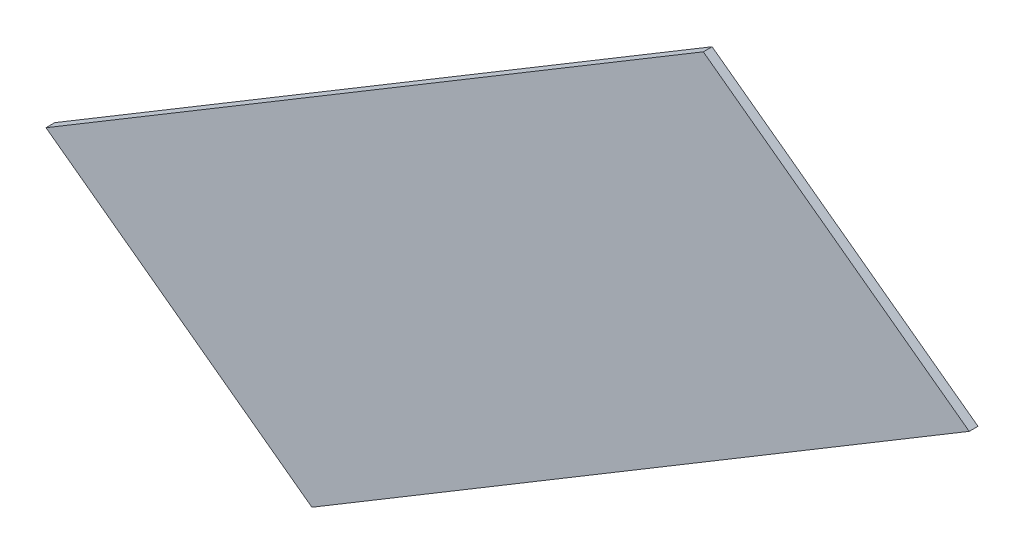
ISO-10303-21;
HEADER;
FILE_DESCRIPTION(('STEP AP214'),'2;1');
FILE_NAME('part.step','',(''),(''),'','','');
FILE_SCHEMA(('AUTOMOTIVE_DESIGN { 1 0 10303 214 1 1 1 1 }'));
ENDSEC;
DATA;
#1=APPLICATION_CONTEXT('core data for automotive mechanical design processes');
#2=APPLICATION_PROTOCOL_DEFINITION('international standard','automotive_design',2000,#1);
#3=PRODUCT_CONTEXT('',#1,'mechanical');
#4=PRODUCT('Part','Part','',(#3));
#5=PRODUCT_RELATED_PRODUCT_CATEGORY('part','',(#4));
#6=PRODUCT_DEFINITION_FORMATION('','',#4);
#7=PRODUCT_DEFINITION_CONTEXT('part definition',#1,'design');
#8=PRODUCT_DEFINITION('design','',#6,#7);
#9=PRODUCT_DEFINITION_SHAPE('','',#8);
#10=(LENGTH_UNIT() NAMED_UNIT(*) SI_UNIT(.MILLI.,.METRE.));
#11=(NAMED_UNIT(*) PLANE_ANGLE_UNIT() SI_UNIT($,.RADIAN.));
#12=(NAMED_UNIT(*) SI_UNIT($,.STERADIAN.) SOLID_ANGLE_UNIT());
#13=UNCERTAINTY_MEASURE_WITH_UNIT(LENGTH_MEASURE(1.E-05),#10,'distance_accuracy_value','');
#14=(GEOMETRIC_REPRESENTATION_CONTEXT(3) GLOBAL_UNCERTAINTY_ASSIGNED_CONTEXT((#13)) GLOBAL_UNIT_ASSIGNED_CONTEXT((#10,
#11,#12)) REPRESENTATION_CONTEXT('',''));
#15=CARTESIAN_POINT('',(0.,0.,0.));
#16=DIRECTION('',(0.,0.,1.));
#17=DIRECTION('',(1.,0.,0.));
#18=AXIS2_PLACEMENT_3D('',#15,#16,#17);
#19=CARTESIAN_POINT('',(32.574920494297,13.734089114766,2.64));
#20=DIRECTION('',(0.,0.,1.));
#21=DIRECTION('',(1.,0.,0.));
#22=AXIS2_PLACEMENT_3D('',#19,#20,#21);
#23=PLANE('',#22);
#24=DIRECTION('',(0.857492968552453,0.514495684027672,0.));
#25=VECTOR('',#24,1.);
#26=CARTESIAN_POINT('',(31.63791421358,16.973622100066,2.64));
#27=LINE('',#26,#25);
#28=CARTESIAN_POINT('',(31.2639873849642,16.7492660452411,2.64));
#29=VERTEX_POINT('',#28);
#30=CARTESIAN_POINT('',(32.0118410421951,17.1979781548911,2.64));
#31=VERTEX_POINT('',#30);
#32=EDGE_CURVE('E80',#29,#31,#27,.T.);
#33=ORIENTED_EDGE('',*,*,#32,.F.);
#34=DIRECTION('',(0.805324891887206,-0.592833719104152,0.));
#35=VECTOR('',#34,1.);
#36=CARTESIAN_POINT('',(31.112709321755,16.860628226809,2.64));
#37=LINE('',#36,#35);
#38=CARTESIAN_POINT('',(30.961431258546,16.9719904083761,2.64));
#39=VERTEX_POINT('',#38);
#40=EDGE_CURVE('E68',#39,#29,#37,.T.);
#41=ORIENTED_EDGE('',*,*,#40,.F.);
#42=DIRECTION('',(-0.857492968552453,-0.514495684027672,0.));
#43=VECTOR('',#42,1.);
#44=CARTESIAN_POINT('',(31.335358087161,17.196346463201,2.64));
#45=LINE('',#44,#43);
#46=CARTESIAN_POINT('',(31.7092849157763,17.4207025180264,2.64));
#47=VERTEX_POINT('',#46);
#48=EDGE_CURVE('E55',#47,#39,#45,.T.);
#49=ORIENTED_EDGE('',*,*,#48,.F.);
#50=DIRECTION('',(-0.805324891887206,0.592833719104152,0.));
#51=VECTOR('',#50,1.);
#52=CARTESIAN_POINT('',(31.860562978986,17.309340336459,2.64));
#53=LINE('',#52,#51);
#54=EDGE_CURVE('E20',#31,#47,#53,.T.);
#55=ORIENTED_EDGE('',*,*,#54,.F.);
#56=EDGE_LOOP('',(#33,#41,#49,#55));
#57=FACE_BOUND('',#56,.T.);
#58=ADVANCED_FACE('F17',(#57),#23,.F.);
#59=CARTESIAN_POINT('',(31.860562978986,17.309340336459,2.64));
#60=DIRECTION('',(0.592833719104152,0.805324891887206,0.));
#61=DIRECTION('',(-0.805324891887206,0.592833719104152,0.));
#62=AXIS2_PLACEMENT_3D('',#59,#60,#61);
#63=PLANE('',#62);
#64=ORIENTED_EDGE('',*,*,#54,.T.);
#65=DIRECTION('',(0.,0.,1.));
#66=VECTOR('',#65,1.);
#67=CARTESIAN_POINT('',(31.709284915776,17.420702518026,2.64));
#68=LINE('',#67,#66);
#69=CARTESIAN_POINT('',(31.7092849157763,17.4207025180264,2.65));
#70=VERTEX_POINT('',#69);
#71=EDGE_CURVE('E61',#70,#47,#68,.F.);
#72=ORIENTED_EDGE('',*,*,#71,.F.);
#73=DIRECTION('',(-0.805324891887812,0.592833719103329,0.));
#74=VECTOR('',#73,1.);
#75=CARTESIAN_POINT('',(32.011841042195,17.197978154891,2.65));
#76=LINE('',#75,#74);
#77=CARTESIAN_POINT('',(32.0118410421952,17.1979781548912,2.65));
#78=VERTEX_POINT('',#77);
#79=EDGE_CURVE('E83',#78,#70,#76,.T.);
#80=ORIENTED_EDGE('',*,*,#79,.F.);
#81=DIRECTION('',(0.,0.,1.));
#82=VECTOR('',#81,1.);
#83=CARTESIAN_POINT('',(32.011841042195,17.197978154891,2.64));
#84=LINE('',#83,#82);
#85=EDGE_CURVE('E64',#31,#78,#84,.T.);
#86=ORIENTED_EDGE('',*,*,#85,.F.);
#87=EDGE_LOOP('',(#64,#72,#80,#86));
#88=FACE_BOUND('',#87,.T.);
#89=ADVANCED_FACE('F60',(#88),#63,.T.);
#90=CARTESIAN_POINT('',(31.335358087161,17.196346463201,2.64));
#91=DIRECTION('',(-0.514495684027672,0.857492968552453,0.));
#92=DIRECTION('',(-0.857492968552453,-0.514495684027672,0.));
#93=AXIS2_PLACEMENT_3D('',#90,#91,#92);
#94=PLANE('',#93);
#95=ORIENTED_EDGE('',*,*,#48,.T.);
#96=DIRECTION('',(0.,0.,1.));
#97=VECTOR('',#96,1.);
#98=CARTESIAN_POINT('',(30.9614312585462,16.9719904083762,2.64));
#99=LINE('',#98,#97);
#100=CARTESIAN_POINT('',(30.961431258546,16.9719904083761,2.65));
#101=VERTEX_POINT('',#100);
#102=EDGE_CURVE('E70',#101,#39,#99,.F.);
#103=ORIENTED_EDGE('',*,*,#102,.F.);
#104=DIRECTION('',(-0.857492968552414,-0.514495684027737,0.));
#105=VECTOR('',#104,1.);
#106=CARTESIAN_POINT('',(31.709284915776,17.420702518026,2.65));
#107=LINE('',#106,#105);
#108=EDGE_CURVE('E74',#70,#101,#107,.T.);
#109=ORIENTED_EDGE('',*,*,#108,.F.);
#110=ORIENTED_EDGE('',*,*,#71,.T.);
#111=EDGE_LOOP('',(#95,#103,#109,#110));
#112=FACE_BOUND('',#111,.T.);
#113=ADVANCED_FACE('F72',(#112),#94,.T.);
#114=CARTESIAN_POINT('',(31.112709321755,16.860628226809,2.64));
#115=DIRECTION('',(-0.592833719104152,-0.805324891887206,0.));
#116=DIRECTION('',(0.805324891887206,-0.592833719104152,0.));
#117=AXIS2_PLACEMENT_3D('',#114,#115,#116);
#118=PLANE('',#117);
#119=ORIENTED_EDGE('',*,*,#40,.T.);
#120=DIRECTION('',(0.,0.,1.));
#121=VECTOR('',#120,1.);
#122=CARTESIAN_POINT('',(31.2639873849642,16.7492660452406,2.64));
#123=LINE('',#122,#121);
#124=CARTESIAN_POINT('',(31.2639873849642,16.7492660452411,2.65));
#125=VERTEX_POINT('',#124);
#126=EDGE_CURVE('E35',#125,#29,#123,.F.);
#127=ORIENTED_EDGE('',*,*,#126,.F.);
#128=DIRECTION('',(0.805324891886866,-0.592833719104613,0.));
#129=VECTOR('',#128,1.);
#130=CARTESIAN_POINT('',(30.961431258546,16.971990408376,2.65));
#131=LINE('',#130,#129);
#132=EDGE_CURVE('E26',#101,#125,#131,.T.);
#133=ORIENTED_EDGE('',*,*,#132,.F.);
#134=ORIENTED_EDGE('',*,*,#102,.T.);
#135=EDGE_LOOP('',(#119,#127,#133,#134));
#136=FACE_BOUND('',#135,.T.);
#137=ADVANCED_FACE('F89',(#136),#118,.T.);
#138=CARTESIAN_POINT('',(31.63791421358,16.973622100066,2.64));
#139=DIRECTION('',(0.514495684027672,-0.857492968552453,0.));
#140=DIRECTION('',(0.857492968552453,0.514495684027672,0.));
#141=AXIS2_PLACEMENT_3D('',#138,#139,#140);
#142=PLANE('',#141);
#143=ORIENTED_EDGE('',*,*,#32,.T.);
#144=ORIENTED_EDGE('',*,*,#85,.T.);
#145=DIRECTION('',(0.857492968552718,0.514495684027231,0.));
#146=VECTOR('',#145,1.);
#147=CARTESIAN_POINT('',(31.263987384964,16.749266045241,2.65));
#148=LINE('',#147,#146);
#149=EDGE_CURVE('E11',#125,#78,#148,.T.);
#150=ORIENTED_EDGE('',*,*,#149,.F.);
#151=ORIENTED_EDGE('',*,*,#126,.T.);
#152=EDGE_LOOP('',(#143,#144,#150,#151));
#153=FACE_BOUND('',#152,.T.);
#154=ADVANCED_FACE('F91',(#153),#142,.T.);
#155=CARTESIAN_POINT('',(32.574920494297,13.734089114766,2.65));
#156=DIRECTION('',(0.,0.,1.));
#157=DIRECTION('',(1.,0.,0.));
#158=AXIS2_PLACEMENT_3D('',#155,#156,#157);
#159=PLANE('',#158);
#160=ORIENTED_EDGE('',*,*,#132,.T.);
#161=ORIENTED_EDGE('',*,*,#149,.T.);
#162=ORIENTED_EDGE('',*,*,#79,.T.);
#163=ORIENTED_EDGE('',*,*,#108,.T.);
#164=EDGE_LOOP('',(#160,#161,#162,#163));
#165=FACE_BOUND('',#164,.T.);
#166=ADVANCED_FACE('F88',(#165),#159,.T.);
#167=CLOSED_SHELL('',(#58,#89,#113,#137,#154,#166));
#168=MANIFOLD_SOLID_BREP('B1',#167);
#169=ADVANCED_BREP_SHAPE_REPRESENTATION('',(#18,#168),#14);
#170=SHAPE_DEFINITION_REPRESENTATION(#9,#169);
ENDSEC;
END-ISO-10303-21;
